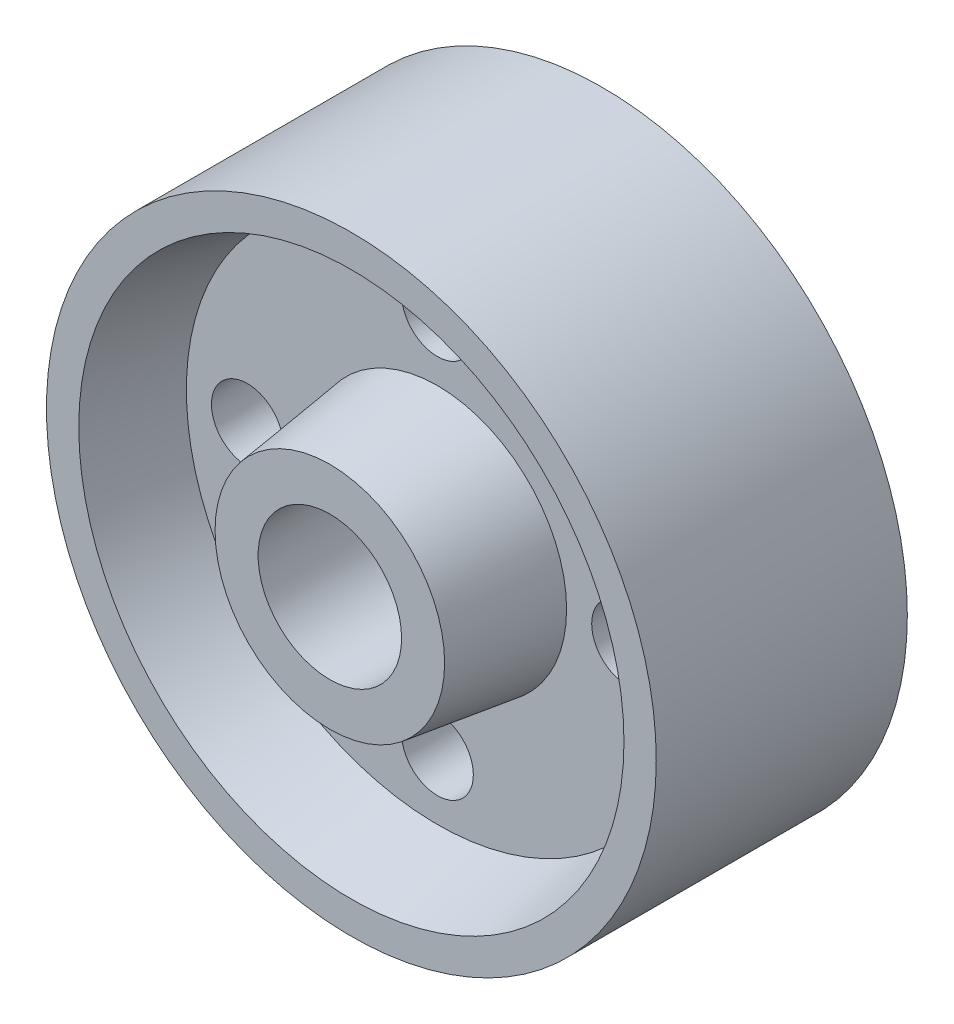
ISO-10303-21;
HEADER;
FILE_DESCRIPTION(('STEP AP214'),'2;1');
FILE_NAME('part.step','',(''),(''),'','','');
FILE_SCHEMA(('AUTOMOTIVE_DESIGN { 1 0 10303 214 1 1 1 1 }'));
ENDSEC;
DATA;
#1=APPLICATION_CONTEXT('core data for automotive mechanical design processes');
#2=APPLICATION_PROTOCOL_DEFINITION('international standard','automotive_design',2000,#1);
#3=PRODUCT_CONTEXT('',#1,'mechanical');
#4=PRODUCT('Part','Part','',(#3));
#5=PRODUCT_RELATED_PRODUCT_CATEGORY('part','',(#4));
#6=PRODUCT_DEFINITION_FORMATION('','',#4);
#7=PRODUCT_DEFINITION_CONTEXT('part definition',#1,'design');
#8=PRODUCT_DEFINITION('design','',#6,#7);
#9=PRODUCT_DEFINITION_SHAPE('','',#8);
#10=(LENGTH_UNIT() NAMED_UNIT(*) SI_UNIT(.MILLI.,.METRE.));
#11=(NAMED_UNIT(*) PLANE_ANGLE_UNIT() SI_UNIT($,.RADIAN.));
#12=(NAMED_UNIT(*) SI_UNIT($,.STERADIAN.) SOLID_ANGLE_UNIT());
#13=UNCERTAINTY_MEASURE_WITH_UNIT(LENGTH_MEASURE(1.E-05),#10,'distance_accuracy_value','');
#14=(GEOMETRIC_REPRESENTATION_CONTEXT(3) GLOBAL_UNCERTAINTY_ASSIGNED_CONTEXT((#13)) GLOBAL_UNIT_ASSIGNED_CONTEXT((#10,
#11,#12)) REPRESENTATION_CONTEXT('',''));
#15=CARTESIAN_POINT('',(0.,0.,0.));
#16=DIRECTION('',(0.,0.,1.));
#17=DIRECTION('',(1.,0.,0.));
#18=AXIS2_PLACEMENT_3D('',#15,#16,#17);
#19=CARTESIAN_POINT('',(0.,42.5,-17.5));
#20=DIRECTION('',(0.,0.,1.));
#21=DIRECTION('',(1.,0.,0.));
#22=AXIS2_PLACEMENT_3D('',#19,#20,#21);
#23=PLANE('',#22);
#24=CARTESIAN_POINT('',(0.,0.,-17.5));
#25=DIRECTION('',(0.,0.,1.));
#26=DIRECTION('',(1.,0.,0.));
#27=AXIS2_PLACEMENT_3D('',#24,#25,#26);
#28=CIRCLE('',#27,42.5);
#29=CARTESIAN_POINT('',(42.5,0.,-17.5));
#30=VERTEX_POINT('',#29);
#31=EDGE_CURVE('E76',#30,#30,#28,.T.);
#32=ORIENTED_EDGE('',*,*,#31,.F.);
#33=EDGE_LOOP('',(#32));
#34=FACE_BOUND('',#33,.T.);
#35=CARTESIAN_POINT('',(0.,0.,-17.5));
#36=DIRECTION('',(0.,0.,1.));
#37=DIRECTION('',(1.,0.,0.));
#38=AXIS2_PLACEMENT_3D('',#35,#36,#37);
#39=CIRCLE('',#38,38.);
#40=CARTESIAN_POINT('',(38.,0.,-17.5));
#41=VERTEX_POINT('',#40);
#42=EDGE_CURVE('E10',#41,#41,#39,.T.);
#43=ORIENTED_EDGE('',*,*,#42,.T.);
#44=EDGE_LOOP('',(#43));
#45=FACE_BOUND('',#44,.T.);
#46=ADVANCED_FACE('F35',(#34,#45),#23,.F.);
#47=CARTESIAN_POINT('',(0.,0.,-5.50000000000001));
#48=DIRECTION('',(0.,0.,-1.));
#49=DIRECTION('',(-1.,0.,0.));
#50=AXIS2_PLACEMENT_3D('',#47,#48,#49);
#51=CONICAL_SURFACE('',#50,35.,0.244978663126864);
#52=ORIENTED_EDGE('',*,*,#42,.F.);
#53=EDGE_LOOP('',(#52));
#54=FACE_BOUND('',#53,.T.);
#55=CARTESIAN_POINT('',(0.,0.,-5.50000000000001));
#56=DIRECTION('',(0.,0.,1.));
#57=DIRECTION('',(1.,0.,0.));
#58=AXIS2_PLACEMENT_3D('',#55,#56,#57);
#59=CIRCLE('',#58,35.);
#60=CARTESIAN_POINT('',(35.,0.,-5.50000000000001));
#61=VERTEX_POINT('',#60);
#62=EDGE_CURVE('E42',#61,#61,#59,.T.);
#63=ORIENTED_EDGE('',*,*,#62,.T.);
#64=EDGE_LOOP('',(#63));
#65=FACE_BOUND('',#64,.T.);
#66=ADVANCED_FACE('F120',(#54,#65),#51,.F.);
#67=CARTESIAN_POINT('',(0.,35.,-5.50000000000001));
#68=DIRECTION('',(0.,0.,1.));
#69=DIRECTION('',(1.,0.,0.));
#70=AXIS2_PLACEMENT_3D('',#67,#68,#69);
#71=PLANE('',#70);
#72=CARTESIAN_POINT('',(0.,26.5,-5.50000000000001));
#73=DIRECTION('',(0.,0.,1.));
#74=DIRECTION('',(1.,0.,0.));
#75=AXIS2_PLACEMENT_3D('',#72,#73,#74);
#76=CIRCLE('',#75,5.);
#77=CARTESIAN_POINT('',(5.,26.5,-5.50000000000001));
#78=VERTEX_POINT('',#77);
#79=EDGE_CURVE('E73',#78,#78,#76,.T.);
#80=ORIENTED_EDGE('',*,*,#79,.T.);
#81=EDGE_LOOP('',(#80));
#82=FACE_BOUND('',#81,.T.);
#83=CARTESIAN_POINT('',(26.5,0.,-5.50000000000001));
#84=DIRECTION('',(0.,0.,1.));
#85=DIRECTION('',(1.,0.,0.));
#86=AXIS2_PLACEMENT_3D('',#83,#84,#85);
#87=CIRCLE('',#86,5.);
#88=CARTESIAN_POINT('',(31.5,0.,-5.50000000000001));
#89=VERTEX_POINT('',#88);
#90=EDGE_CURVE('E61',#89,#89,#87,.T.);
#91=ORIENTED_EDGE('',*,*,#90,.T.);
#92=EDGE_LOOP('',(#91));
#93=FACE_BOUND('',#92,.T.);
#94=CARTESIAN_POINT('',(0.,-26.5,-5.50000000000001));
#95=DIRECTION('',(0.,0.,1.));
#96=DIRECTION('',(1.,0.,0.));
#97=AXIS2_PLACEMENT_3D('',#94,#95,#96);
#98=CIRCLE('',#97,5.);
#99=CARTESIAN_POINT('',(5.,-26.5,-5.50000000000001));
#100=VERTEX_POINT('',#99);
#101=EDGE_CURVE('E58',#100,#100,#98,.T.);
#102=ORIENTED_EDGE('',*,*,#101,.T.);
#103=EDGE_LOOP('',(#102));
#104=FACE_BOUND('',#103,.T.);
#105=CARTESIAN_POINT('',(-26.5,0.,-5.50000000000001));
#106=DIRECTION('',(0.,0.,1.));
#107=DIRECTION('',(1.,0.,0.));
#108=AXIS2_PLACEMENT_3D('',#105,#106,#107);
#109=CIRCLE('',#108,5.);
#110=CARTESIAN_POINT('',(-21.5,0.,-5.50000000000001));
#111=VERTEX_POINT('',#110);
#112=EDGE_CURVE('E54',#111,#111,#109,.T.);
#113=ORIENTED_EDGE('',*,*,#112,.T.);
#114=EDGE_LOOP('',(#113));
#115=FACE_BOUND('',#114,.T.);
#116=ORIENTED_EDGE('',*,*,#62,.F.);
#117=EDGE_LOOP('',(#116));
#118=FACE_BOUND('',#117,.T.);
#119=CARTESIAN_POINT('',(0.,0.,-5.50000000000001));
#120=DIRECTION('',(0.,0.,1.));
#121=DIRECTION('',(1.,0.,0.));
#122=AXIS2_PLACEMENT_3D('',#119,#120,#121);
#123=CIRCLE('',#122,18.);
#124=CARTESIAN_POINT('',(18.,0.,-5.50000000000001));
#125=VERTEX_POINT('',#124);
#126=EDGE_CURVE('E47',#125,#125,#123,.T.);
#127=ORIENTED_EDGE('',*,*,#126,.T.);
#128=EDGE_LOOP('',(#127));
#129=FACE_BOUND('',#128,.T.);
#130=ADVANCED_FACE('F99',(#82,#93,#104,#115,#118,#129),#71,.F.);
#131=CARTESIAN_POINT('',(0.,0.,-20.5));
#132=DIRECTION('',(0.,0.,1.));
#133=DIRECTION('',(1.,0.,0.));
#134=AXIS2_PLACEMENT_3D('',#131,#132,#133);
#135=CONICAL_SURFACE('',#134,16.,0.132551532296674);
#136=ORIENTED_EDGE('',*,*,#126,.F.);
#137=EDGE_LOOP('',(#136));
#138=FACE_BOUND('',#137,.T.);
#139=CARTESIAN_POINT('',(0.,0.,-20.5));
#140=DIRECTION('',(0.,0.,1.));
#141=DIRECTION('',(1.,0.,0.));
#142=AXIS2_PLACEMENT_3D('',#139,#140,#141);
#143=CIRCLE('',#142,16.);
#144=CARTESIAN_POINT('',(16.,0.,-20.5));
#145=VERTEX_POINT('',#144);
#146=EDGE_CURVE('E94',#145,#145,#143,.T.);
#147=ORIENTED_EDGE('',*,*,#146,.T.);
#148=EDGE_LOOP('',(#147));
#149=FACE_BOUND('',#148,.T.);
#150=ADVANCED_FACE('F101',(#138,#149),#135,.T.);
#151=CARTESIAN_POINT('',(0.,16.,-20.5));
#152=DIRECTION('',(0.,0.,1.));
#153=DIRECTION('',(1.,0.,0.));
#154=AXIS2_PLACEMENT_3D('',#151,#152,#153);
#155=PLANE('',#154);
#156=CARTESIAN_POINT('',(0.,0.,-20.5));
#157=DIRECTION('',(0.,0.,1.));
#158=DIRECTION('',(1.,0.,0.));
#159=AXIS2_PLACEMENT_3D('',#156,#157,#158);
#160=CIRCLE('',#159,10.);
#161=CARTESIAN_POINT('',(10.,0.,-20.5));
#162=VERTEX_POINT('',#161);
#163=EDGE_CURVE('E55',#162,#162,#160,.T.);
#164=ORIENTED_EDGE('',*,*,#163,.T.);
#165=EDGE_LOOP('',(#164));
#166=FACE_BOUND('',#165,.T.);
#167=ORIENTED_EDGE('',*,*,#146,.F.);
#168=EDGE_LOOP('',(#167));
#169=FACE_BOUND('',#168,.T.);
#170=ADVANCED_FACE('F104',(#166,#169),#155,.F.);
#171=CARTESIAN_POINT('',(0.,16.0000000000001,20.5));
#172=DIRECTION('',(0.,0.,-1.));
#173=DIRECTION('',(-1.,0.,0.));
#174=AXIS2_PLACEMENT_3D('',#171,#172,#173);
#175=PLANE('',#174);
#176=CARTESIAN_POINT('',(0.,0.,20.5));
#177=DIRECTION('',(0.,0.,1.));
#178=DIRECTION('',(1.,0.,0.));
#179=AXIS2_PLACEMENT_3D('',#176,#177,#178);
#180=CIRCLE('',#179,10.);
#181=CARTESIAN_POINT('',(10.,0.,20.5));
#182=VERTEX_POINT('',#181);
#183=EDGE_CURVE('E288',#182,#182,#180,.T.);
#184=ORIENTED_EDGE('',*,*,#183,.F.);
#185=EDGE_LOOP('',(#184));
#186=FACE_BOUND('',#185,.T.);
#187=CARTESIAN_POINT('',(0.,0.,20.5));
#188=DIRECTION('',(0.,0.,1.));
#189=DIRECTION('',(1.,0.,0.));
#190=AXIS2_PLACEMENT_3D('',#187,#188,#189);
#191=CIRCLE('',#190,16.0000000000001);
#192=CARTESIAN_POINT('',(16.0000000000001,0.,20.5));
#193=VERTEX_POINT('',#192);
#194=EDGE_CURVE('E91',#193,#193,#191,.T.);
#195=ORIENTED_EDGE('',*,*,#194,.T.);
#196=EDGE_LOOP('',(#195));
#197=FACE_BOUND('',#196,.T.);
#198=ADVANCED_FACE('F109',(#186,#197),#175,.F.);
#199=CARTESIAN_POINT('',(0.,0.,5.50000000000001));
#200=DIRECTION('',(0.,0.,-1.));
#201=DIRECTION('',(-1.,0.,0.));
#202=AXIS2_PLACEMENT_3D('',#199,#200,#201);
#203=CONICAL_SURFACE('',#202,18.0000000000001,0.132551532296674);
#204=ORIENTED_EDGE('',*,*,#194,.F.);
#205=EDGE_LOOP('',(#204));
#206=FACE_BOUND('',#205,.T.);
#207=CARTESIAN_POINT('',(0.,0.,5.50000000000001));
#208=DIRECTION('',(0.,0.,1.));
#209=DIRECTION('',(1.,0.,0.));
#210=AXIS2_PLACEMENT_3D('',#207,#208,#209);
#211=CIRCLE('',#210,18.0000000000001);
#212=CARTESIAN_POINT('',(18.0000000000001,0.,5.50000000000001));
#213=VERTEX_POINT('',#212);
#214=EDGE_CURVE('E88',#213,#213,#211,.T.);
#215=ORIENTED_EDGE('',*,*,#214,.T.);
#216=EDGE_LOOP('',(#215));
#217=FACE_BOUND('',#216,.T.);
#218=ADVANCED_FACE('F115',(#206,#217),#203,.T.);
#219=CARTESIAN_POINT('',(0.,35.0000000000001,5.50000000000001));
#220=DIRECTION('',(0.,0.,-1.));
#221=DIRECTION('',(-1.,0.,0.));
#222=AXIS2_PLACEMENT_3D('',#219,#220,#221);
#223=PLANE('',#222);
#224=CARTESIAN_POINT('',(0.,26.5,5.50000000000001));
#225=DIRECTION('',(0.,0.,-1.));
#226=DIRECTION('',(-1.,0.,0.));
#227=AXIS2_PLACEMENT_3D('',#224,#225,#226);
#228=CIRCLE('',#227,5.);
#229=CARTESIAN_POINT('',(-5.,26.5,5.50000000000001));
#230=VERTEX_POINT('',#229);
#231=EDGE_CURVE('E38',#230,#230,#228,.T.);
#232=ORIENTED_EDGE('',*,*,#231,.T.);
#233=EDGE_LOOP('',(#232));
#234=FACE_BOUND('',#233,.T.);
#235=CARTESIAN_POINT('',(26.5,0.,5.50000000000001));
#236=DIRECTION('',(0.,0.,-1.));
#237=DIRECTION('',(-1.,0.,0.));
#238=AXIS2_PLACEMENT_3D('',#235,#236,#237);
#239=CIRCLE('',#238,5.);
#240=CARTESIAN_POINT('',(21.5,0.,5.50000000000001));
#241=VERTEX_POINT('',#240);
#242=EDGE_CURVE('E59',#241,#241,#239,.T.);
#243=ORIENTED_EDGE('',*,*,#242,.T.);
#244=EDGE_LOOP('',(#243));
#245=FACE_BOUND('',#244,.T.);
#246=CARTESIAN_POINT('',(0.,-26.5,5.50000000000001));
#247=DIRECTION('',(0.,0.,-1.));
#248=DIRECTION('',(-1.,0.,0.));
#249=AXIS2_PLACEMENT_3D('',#246,#247,#248);
#250=CIRCLE('',#249,5.);
#251=CARTESIAN_POINT('',(-5.,-26.5,5.50000000000001));
#252=VERTEX_POINT('',#251);
#253=EDGE_CURVE('E56',#252,#252,#250,.T.);
#254=ORIENTED_EDGE('',*,*,#253,.T.);
#255=EDGE_LOOP('',(#254));
#256=FACE_BOUND('',#255,.T.);
#257=CARTESIAN_POINT('',(-26.5,0.,5.50000000000001));
#258=DIRECTION('',(0.,0.,-1.));
#259=DIRECTION('',(-1.,0.,0.));
#260=AXIS2_PLACEMENT_3D('',#257,#258,#259);
#261=CIRCLE('',#260,5.);
#262=CARTESIAN_POINT('',(-31.5,0.,5.50000000000001));
#263=VERTEX_POINT('',#262);
#264=EDGE_CURVE('E51',#263,#263,#261,.T.);
#265=ORIENTED_EDGE('',*,*,#264,.T.);
#266=EDGE_LOOP('',(#265));
#267=FACE_BOUND('',#266,.T.);
#268=ORIENTED_EDGE('',*,*,#214,.F.);
#269=EDGE_LOOP('',(#268));
#270=FACE_BOUND('',#269,.T.);
#271=CARTESIAN_POINT('',(0.,0.,5.50000000000001));
#272=DIRECTION('',(0.,0.,1.));
#273=DIRECTION('',(1.,0.,0.));
#274=AXIS2_PLACEMENT_3D('',#271,#272,#273);
#275=CIRCLE('',#274,35.0000000000001);
#276=CARTESIAN_POINT('',(35.0000000000001,0.,5.50000000000001));
#277=VERTEX_POINT('',#276);
#278=EDGE_CURVE('E85',#277,#277,#275,.T.);
#279=ORIENTED_EDGE('',*,*,#278,.T.);
#280=EDGE_LOOP('',(#279));
#281=FACE_BOUND('',#280,.T.);
#282=ADVANCED_FACE('F151',(#234,#245,#256,#267,#270,#281),#223,.F.);
#283=CARTESIAN_POINT('',(0.,0.,17.5));
#284=DIRECTION('',(0.,0.,1.));
#285=DIRECTION('',(1.,0.,0.));
#286=AXIS2_PLACEMENT_3D('',#283,#284,#285);
#287=CONICAL_SURFACE('',#286,38.0000000000001,0.244978663126864);
#288=ORIENTED_EDGE('',*,*,#278,.F.);
#289=EDGE_LOOP('',(#288));
#290=FACE_BOUND('',#289,.T.);
#291=CARTESIAN_POINT('',(0.,0.,17.5));
#292=DIRECTION('',(0.,0.,1.));
#293=DIRECTION('',(1.,0.,0.));
#294=AXIS2_PLACEMENT_3D('',#291,#292,#293);
#295=CIRCLE('',#294,38.0000000000001);
#296=CARTESIAN_POINT('',(38.0000000000001,0.,17.5));
#297=VERTEX_POINT('',#296);
#298=EDGE_CURVE('E82',#297,#297,#295,.T.);
#299=ORIENTED_EDGE('',*,*,#298,.T.);
#300=EDGE_LOOP('',(#299));
#301=FACE_BOUND('',#300,.T.);
#302=ADVANCED_FACE('F141',(#290,#301),#287,.F.);
#303=CARTESIAN_POINT('',(0.,42.5000000000001,17.5));
#304=DIRECTION('',(0.,0.,-1.));
#305=DIRECTION('',(-1.,0.,0.));
#306=AXIS2_PLACEMENT_3D('',#303,#304,#305);
#307=PLANE('',#306);
#308=ORIENTED_EDGE('',*,*,#298,.F.);
#309=EDGE_LOOP('',(#308));
#310=FACE_BOUND('',#309,.T.);
#311=CARTESIAN_POINT('',(0.,0.,17.5));
#312=DIRECTION('',(0.,0.,1.));
#313=DIRECTION('',(1.,0.,0.));
#314=AXIS2_PLACEMENT_3D('',#311,#312,#313);
#315=CIRCLE('',#314,42.5000000000001);
#316=CARTESIAN_POINT('',(42.5000000000001,0.,17.5));
#317=VERTEX_POINT('',#316);
#318=EDGE_CURVE('E79',#317,#317,#315,.T.);
#319=ORIENTED_EDGE('',*,*,#318,.T.);
#320=EDGE_LOOP('',(#319));
#321=FACE_BOUND('',#320,.T.);
#322=ADVANCED_FACE('F131',(#310,#321),#307,.F.);
#323=CARTESIAN_POINT('',(0.,0.,152.018729057145));
#324=DIRECTION('',(0.,0.,1.));
#325=DIRECTION('',(1.,0.,0.));
#326=AXIS2_PLACEMENT_3D('',#323,#324,#325);
#327=CYLINDRICAL_SURFACE('',#326,42.5);
#328=ORIENTED_EDGE('',*,*,#318,.F.);
#329=EDGE_LOOP('',(#328));
#330=FACE_BOUND('',#329,.T.);
#331=ORIENTED_EDGE('',*,*,#31,.T.);
#332=EDGE_LOOP('',(#331));
#333=FACE_BOUND('',#332,.T.);
#334=ADVANCED_FACE('F128',(#330,#333),#327,.T.);
#335=CARTESIAN_POINT('',(-26.5,0.,-20.5));
#336=DIRECTION('',(0.,0.,1.));
#337=DIRECTION('',(1.,0.,0.));
#338=AXIS2_PLACEMENT_3D('',#335,#336,#337);
#339=CYLINDRICAL_SURFACE('',#338,5.);
#340=ORIENTED_EDGE('',*,*,#264,.F.);
#341=EDGE_LOOP('',(#340));
#342=FACE_BOUND('',#341,.T.);
#343=ORIENTED_EDGE('',*,*,#112,.F.);
#344=EDGE_LOOP('',(#343));
#345=FACE_BOUND('',#344,.T.);
#346=ADVANCED_FACE('F130',(#342,#345),#339,.F.);
#347=CARTESIAN_POINT('',(0.,-26.5,-20.5));
#348=DIRECTION('',(0.,0.,1.));
#349=DIRECTION('',(1.,0.,0.));
#350=AXIS2_PLACEMENT_3D('',#347,#348,#349);
#351=CYLINDRICAL_SURFACE('',#350,5.);
#352=ORIENTED_EDGE('',*,*,#253,.F.);
#353=EDGE_LOOP('',(#352));
#354=FACE_BOUND('',#353,.T.);
#355=ORIENTED_EDGE('',*,*,#101,.F.);
#356=EDGE_LOOP('',(#355));
#357=FACE_BOUND('',#356,.T.);
#358=ADVANCED_FACE('F138',(#354,#357),#351,.F.);
#359=CARTESIAN_POINT('',(26.5,0.,-20.5));
#360=DIRECTION('',(0.,0.,1.));
#361=DIRECTION('',(1.,0.,0.));
#362=AXIS2_PLACEMENT_3D('',#359,#360,#361);
#363=CYLINDRICAL_SURFACE('',#362,5.);
#364=ORIENTED_EDGE('',*,*,#242,.F.);
#365=EDGE_LOOP('',(#364));
#366=FACE_BOUND('',#365,.T.);
#367=ORIENTED_EDGE('',*,*,#90,.F.);
#368=EDGE_LOOP('',(#367));
#369=FACE_BOUND('',#368,.T.);
#370=ADVANCED_FACE('F243',(#366,#369),#363,.F.);
#371=CARTESIAN_POINT('',(0.,26.5,-20.5));
#372=DIRECTION('',(0.,0.,1.));
#373=DIRECTION('',(1.,0.,0.));
#374=AXIS2_PLACEMENT_3D('',#371,#372,#373);
#375=CYLINDRICAL_SURFACE('',#374,5.);
#376=ORIENTED_EDGE('',*,*,#231,.F.);
#377=EDGE_LOOP('',(#376));
#378=FACE_BOUND('',#377,.T.);
#379=ORIENTED_EDGE('',*,*,#79,.F.);
#380=EDGE_LOOP('',(#379));
#381=FACE_BOUND('',#380,.T.);
#382=ADVANCED_FACE('F253',(#378,#381),#375,.F.);
#383=CARTESIAN_POINT('',(0.,0.,-20.5));
#384=DIRECTION('',(0.,0.,1.));
#385=DIRECTION('',(1.,0.,0.));
#386=AXIS2_PLACEMENT_3D('',#383,#384,#385);
#387=CYLINDRICAL_SURFACE('',#386,10.);
#388=ORIENTED_EDGE('',*,*,#163,.F.);
#389=EDGE_LOOP('',(#388));
#390=FACE_BOUND('',#389,.T.);
#391=ORIENTED_EDGE('',*,*,#183,.T.);
#392=EDGE_LOOP('',(#391));
#393=FACE_BOUND('',#392,.T.);
#394=ADVANCED_FACE('F146',(#390,#393),#387,.F.);
#395=CLOSED_SHELL('',(#46,#66,#130,#150,#170,#198,#218,#282,#302,#322,#334,#346,#358,#370,#382,#394));
#396=MANIFOLD_SOLID_BREP('B2',#395);
#397=ADVANCED_BREP_SHAPE_REPRESENTATION('',(#18,#396),#14);
#398=SHAPE_DEFINITION_REPRESENTATION(#9,#397);
ENDSEC;
END-ISO-10303-21;
